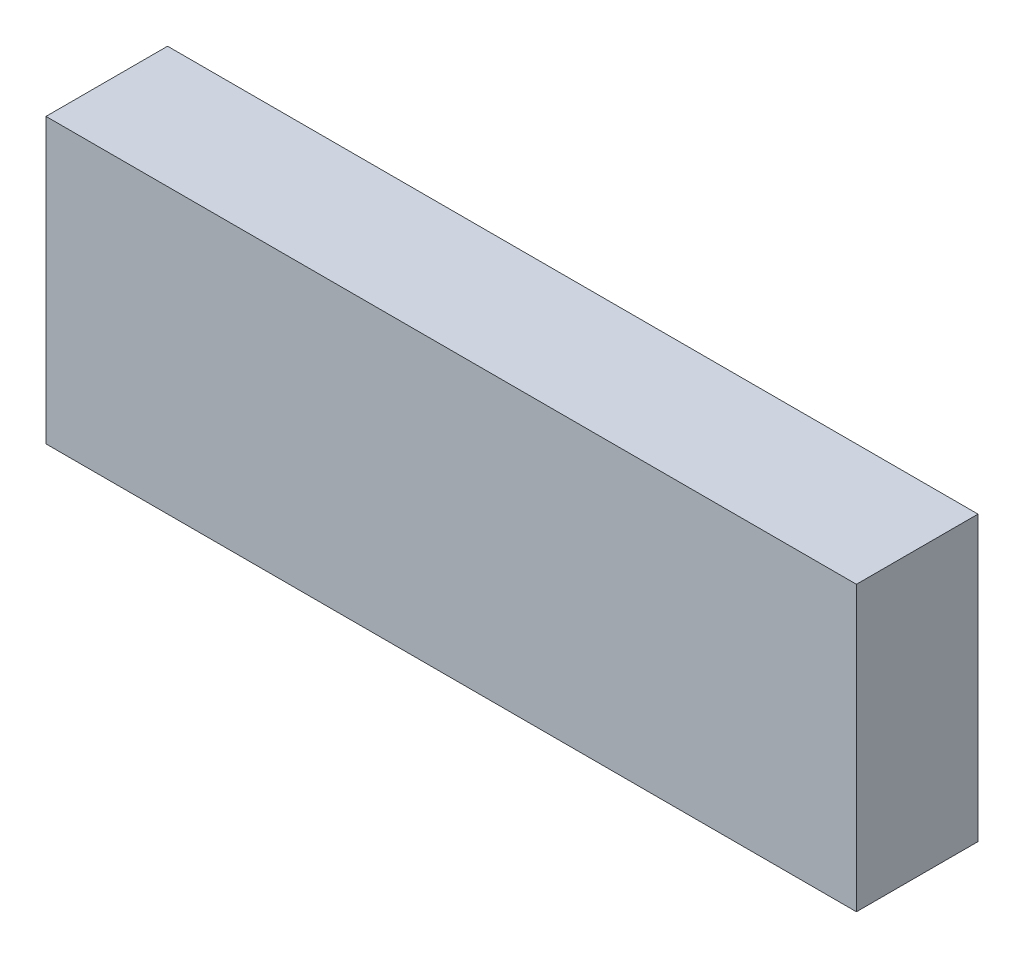
ISO-10303-21;
HEADER;
FILE_DESCRIPTION(('STEP AP214'),'2;1');
FILE_NAME('part.step','',(''),(''),'','','');
FILE_SCHEMA(('AUTOMOTIVE_DESIGN { 1 0 10303 214 1 1 1 1 }'));
ENDSEC;
DATA;
#1=APPLICATION_CONTEXT('core data for automotive mechanical design processes');
#2=APPLICATION_PROTOCOL_DEFINITION('international standard','automotive_design',2000,#1);
#3=PRODUCT_CONTEXT('',#1,'mechanical');
#4=PRODUCT('Part','Part','',(#3));
#5=PRODUCT_RELATED_PRODUCT_CATEGORY('part','',(#4));
#6=PRODUCT_DEFINITION_FORMATION('','',#4);
#7=PRODUCT_DEFINITION_CONTEXT('part definition',#1,'design');
#8=PRODUCT_DEFINITION('design','',#6,#7);
#9=PRODUCT_DEFINITION_SHAPE('','',#8);
#10=(LENGTH_UNIT() NAMED_UNIT(*) SI_UNIT(.MILLI.,.METRE.));
#11=(NAMED_UNIT(*) PLANE_ANGLE_UNIT() SI_UNIT($,.RADIAN.));
#12=(NAMED_UNIT(*) SI_UNIT($,.STERADIAN.) SOLID_ANGLE_UNIT());
#13=UNCERTAINTY_MEASURE_WITH_UNIT(LENGTH_MEASURE(1.E-05),#10,'distance_accuracy_value','');
#14=(GEOMETRIC_REPRESENTATION_CONTEXT(3) GLOBAL_UNCERTAINTY_ASSIGNED_CONTEXT((#13)) GLOBAL_UNIT_ASSIGNED_CONTEXT((#10,
#11,#12)) REPRESENTATION_CONTEXT('',''));
#15=CARTESIAN_POINT('',(0.,0.,0.));
#16=DIRECTION('',(0.,0.,1.));
#17=DIRECTION('',(1.,0.,0.));
#18=AXIS2_PLACEMENT_3D('',#15,#16,#17);
#19=CARTESIAN_POINT('',(0.,0.,38.1));
#20=DIRECTION('',(1.,0.,0.));
#21=DIRECTION('',(0.,0.,-1.));
#22=AXIS2_PLACEMENT_3D('',#19,#20,#21);
#23=PLANE('',#22);
#24=DIRECTION('',(0.,-1.,0.));
#25=VECTOR('',#24,1.);
#26=CARTESIAN_POINT('',(0.,0.,0.));
#27=LINE('',#26,#25);
#28=CARTESIAN_POINT('',(0.,88.9,0.));
#29=VERTEX_POINT('',#28);
#30=CARTESIAN_POINT('',(0.,0.,0.));
#31=VERTEX_POINT('',#30);
#32=EDGE_CURVE('E99',#29,#31,#27,.T.);
#33=ORIENTED_EDGE('',*,*,#32,.T.);
#34=DIRECTION('',(0.,0.,-1.));
#35=VECTOR('',#34,1.);
#36=CARTESIAN_POINT('',(0.,0.,38.1));
#37=LINE('',#36,#35);
#38=CARTESIAN_POINT('',(0.,0.,38.1));
#39=VERTEX_POINT('',#38);
#40=EDGE_CURVE('E11',#39,#31,#37,.T.);
#41=ORIENTED_EDGE('',*,*,#40,.F.);
#42=DIRECTION('',(0.,-1.,0.));
#43=VECTOR('',#42,1.);
#44=CARTESIAN_POINT('',(0.,0.,38.1));
#45=LINE('',#44,#43);
#46=CARTESIAN_POINT('',(0.,88.9,38.1));
#47=VERTEX_POINT('',#46);
#48=EDGE_CURVE('E87',#47,#39,#45,.T.);
#49=ORIENTED_EDGE('',*,*,#48,.F.);
#50=DIRECTION('',(0.,0.,-1.));
#51=VECTOR('',#50,1.);
#52=CARTESIAN_POINT('',(0.,88.9,38.1));
#53=LINE('',#52,#51);
#54=EDGE_CURVE('E95',#47,#29,#53,.T.);
#55=ORIENTED_EDGE('',*,*,#54,.T.);
#56=EDGE_LOOP('',(#33,#41,#49,#55));
#57=FACE_BOUND('',#56,.T.);
#58=ADVANCED_FACE('F36',(#57),#23,.F.);
#59=CARTESIAN_POINT('',(0.,0.,38.1));
#60=DIRECTION('',(0.,1.,0.));
#61=DIRECTION('',(0.,0.,1.));
#62=AXIS2_PLACEMENT_3D('',#59,#60,#61);
#63=PLANE('',#62);
#64=DIRECTION('',(1.,0.,0.));
#65=VECTOR('',#64,1.);
#66=CARTESIAN_POINT('',(0.,0.,0.));
#67=LINE('',#66,#65);
#68=CARTESIAN_POINT('',(254.,0.,0.));
#69=VERTEX_POINT('',#68);
#70=EDGE_CURVE('E91',#31,#69,#67,.T.);
#71=ORIENTED_EDGE('',*,*,#70,.T.);
#72=DIRECTION('',(0.,0.,-1.));
#73=VECTOR('',#72,1.);
#74=CARTESIAN_POINT('',(254.,0.,38.1));
#75=LINE('',#74,#73);
#76=CARTESIAN_POINT('',(254.,0.,38.1));
#77=VERTEX_POINT('',#76);
#78=EDGE_CURVE('E44',#77,#69,#75,.T.);
#79=ORIENTED_EDGE('',*,*,#78,.F.);
#80=DIRECTION('',(1.,0.,0.));
#81=VECTOR('',#80,1.);
#82=CARTESIAN_POINT('',(0.,0.,38.1));
#83=LINE('',#82,#81);
#84=EDGE_CURVE('E82',#39,#77,#83,.T.);
#85=ORIENTED_EDGE('',*,*,#84,.F.);
#86=ORIENTED_EDGE('',*,*,#40,.T.);
#87=EDGE_LOOP('',(#71,#79,#85,#86));
#88=FACE_BOUND('',#87,.T.);
#89=ADVANCED_FACE('F90',(#88),#63,.F.);
#90=CARTESIAN_POINT('',(254.,0.,38.1));
#91=DIRECTION('',(-1.,0.,0.));
#92=DIRECTION('',(0.,0.,1.));
#93=AXIS2_PLACEMENT_3D('',#90,#91,#92);
#94=PLANE('',#93);
#95=DIRECTION('',(0.,1.,0.));
#96=VECTOR('',#95,1.);
#97=CARTESIAN_POINT('',(254.,0.,0.));
#98=LINE('',#97,#96);
#99=CARTESIAN_POINT('',(254.,88.9,0.));
#100=VERTEX_POINT('',#99);
#101=EDGE_CURVE('E69',#69,#100,#98,.T.);
#102=ORIENTED_EDGE('',*,*,#101,.T.);
#103=DIRECTION('',(0.,0.,-1.));
#104=VECTOR('',#103,1.);
#105=CARTESIAN_POINT('',(254.,88.9,38.1));
#106=LINE('',#105,#104);
#107=CARTESIAN_POINT('',(254.,88.9,38.1));
#108=VERTEX_POINT('',#107);
#109=EDGE_CURVE('E92',#108,#100,#106,.T.);
#110=ORIENTED_EDGE('',*,*,#109,.F.);
#111=DIRECTION('',(0.,1.,0.));
#112=VECTOR('',#111,1.);
#113=CARTESIAN_POINT('',(254.,0.,38.1));
#114=LINE('',#113,#112);
#115=EDGE_CURVE('E85',#77,#108,#114,.T.);
#116=ORIENTED_EDGE('',*,*,#115,.F.);
#117=ORIENTED_EDGE('',*,*,#78,.T.);
#118=EDGE_LOOP('',(#102,#110,#116,#117));
#119=FACE_BOUND('',#118,.T.);
#120=ADVANCED_FACE('F93',(#119),#94,.F.);
#121=CARTESIAN_POINT('',(0.,88.9,38.1));
#122=DIRECTION('',(0.,-1.,0.));
#123=DIRECTION('',(0.,0.,-1.));
#124=AXIS2_PLACEMENT_3D('',#121,#122,#123);
#125=PLANE('',#124);
#126=DIRECTION('',(-1.,0.,0.));
#127=VECTOR('',#126,1.);
#128=CARTESIAN_POINT('',(0.,88.9,0.));
#129=LINE('',#128,#127);
#130=EDGE_CURVE('E75',#100,#29,#129,.T.);
#131=ORIENTED_EDGE('',*,*,#130,.T.);
#132=ORIENTED_EDGE('',*,*,#54,.F.);
#133=DIRECTION('',(-1.,0.,0.));
#134=VECTOR('',#133,1.);
#135=CARTESIAN_POINT('',(0.,88.9,38.1));
#136=LINE('',#135,#134);
#137=EDGE_CURVE('E52',#108,#47,#136,.T.);
#138=ORIENTED_EDGE('',*,*,#137,.F.);
#139=ORIENTED_EDGE('',*,*,#109,.T.);
#140=EDGE_LOOP('',(#131,#132,#138,#139));
#141=FACE_BOUND('',#140,.T.);
#142=ADVANCED_FACE('F106',(#141),#125,.F.);
#143=CARTESIAN_POINT('',(0.,0.,38.1));
#144=DIRECTION('',(0.,0.,-1.));
#145=DIRECTION('',(-1.,0.,0.));
#146=AXIS2_PLACEMENT_3D('',#143,#144,#145);
#147=PLANE('',#146);
#148=ORIENTED_EDGE('',*,*,#48,.T.);
#149=ORIENTED_EDGE('',*,*,#84,.T.);
#150=ORIENTED_EDGE('',*,*,#115,.T.);
#151=ORIENTED_EDGE('',*,*,#137,.T.);
#152=EDGE_LOOP('',(#148,#149,#150,#151));
#153=FACE_BOUND('',#152,.T.);
#154=ADVANCED_FACE('F83',(#153),#147,.F.);
#155=CARTESIAN_POINT('',(0.,0.,0.));
#156=DIRECTION('',(0.,0.,-1.));
#157=DIRECTION('',(-1.,0.,0.));
#158=AXIS2_PLACEMENT_3D('',#155,#156,#157);
#159=PLANE('',#158);
#160=ORIENTED_EDGE('',*,*,#32,.F.);
#161=ORIENTED_EDGE('',*,*,#130,.F.);
#162=ORIENTED_EDGE('',*,*,#101,.F.);
#163=ORIENTED_EDGE('',*,*,#70,.F.);
#164=EDGE_LOOP('',(#160,#161,#162,#163));
#165=FACE_BOUND('',#164,.T.);
#166=ADVANCED_FACE('F109',(#165),#159,.T.);
#167=CLOSED_SHELL('',(#58,#89,#120,#142,#154,#166));
#168=MANIFOLD_SOLID_BREP('B2',#167);
#169=ADVANCED_BREP_SHAPE_REPRESENTATION('',(#18,#168),#14);
#170=SHAPE_DEFINITION_REPRESENTATION(#9,#169);
ENDSEC;
END-ISO-10303-21;
